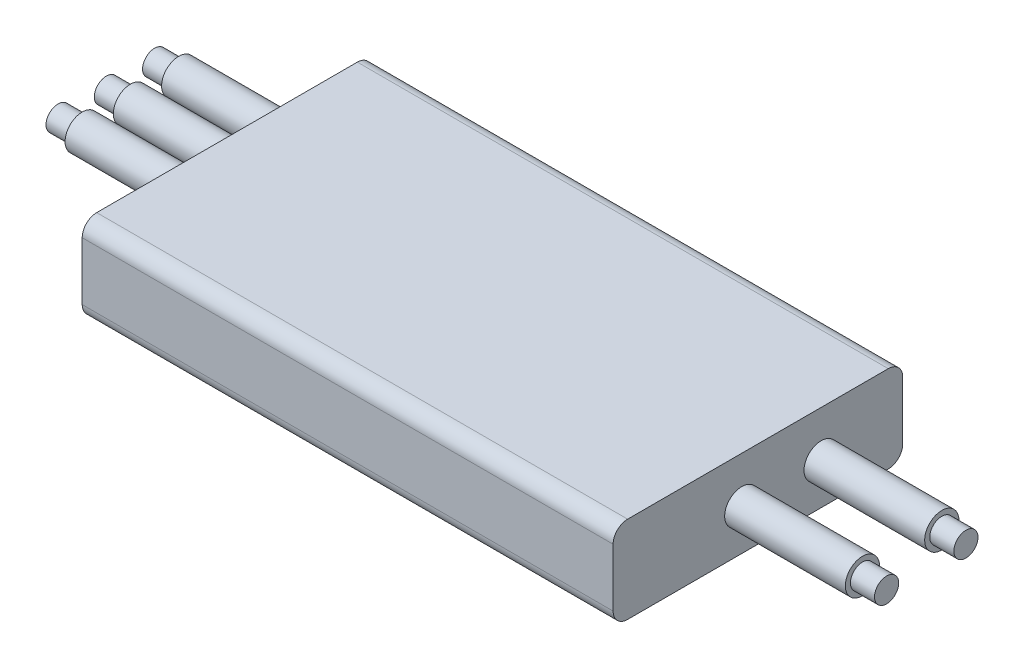
ISO-10303-21;
HEADER;
FILE_DESCRIPTION(('STEP AP214'),'2;1');
FILE_NAME('part.step','',(''),(''),'','','');
FILE_SCHEMA(('AUTOMOTIVE_DESIGN { 1 0 10303 214 1 1 1 1 }'));
ENDSEC;
DATA;
#1=APPLICATION_CONTEXT('core data for automotive mechanical design processes');
#2=APPLICATION_PROTOCOL_DEFINITION('international standard','automotive_design',2000,#1);
#3=PRODUCT_CONTEXT('',#1,'mechanical');
#4=PRODUCT('Part','Part','',(#3));
#5=PRODUCT_RELATED_PRODUCT_CATEGORY('part','',(#4));
#6=PRODUCT_DEFINITION_FORMATION('','',#4);
#7=PRODUCT_DEFINITION_CONTEXT('part definition',#1,'design');
#8=PRODUCT_DEFINITION('design','',#6,#7);
#9=PRODUCT_DEFINITION_SHAPE('','',#8);
#10=(LENGTH_UNIT() NAMED_UNIT(*) SI_UNIT(.MILLI.,.METRE.));
#11=(NAMED_UNIT(*) PLANE_ANGLE_UNIT() SI_UNIT($,.RADIAN.));
#12=(NAMED_UNIT(*) SI_UNIT($,.STERADIAN.) SOLID_ANGLE_UNIT());
#13=UNCERTAINTY_MEASURE_WITH_UNIT(LENGTH_MEASURE(1.E-05),#10,'distance_accuracy_value','');
#14=(GEOMETRIC_REPRESENTATION_CONTEXT(3) GLOBAL_UNCERTAINTY_ASSIGNED_CONTEXT((#13)) GLOBAL_UNIT_ASSIGNED_CONTEXT((#10,
#11,#12)) REPRESENTATION_CONTEXT('',''));
#15=CARTESIAN_POINT('',(0.,0.,0.));
#16=DIRECTION('',(0.,0.,1.));
#17=DIRECTION('',(1.,0.,0.));
#18=AXIS2_PLACEMENT_3D('',#15,#16,#17);
#19=CARTESIAN_POINT('',(55.,18.,30.));
#20=DIRECTION('',(-1.,0.,0.));
#21=DIRECTION('',(0.,0.,1.));
#22=AXIS2_PLACEMENT_3D('',#19,#20,#21);
#23=PLANE('',#22);
#24=CARTESIAN_POINT('',(55.,8.46731324057259,3.3455868551151));
#25=DIRECTION('',(-1.,0.,0.));
#26=DIRECTION('',(0.,0.,1.));
#27=AXIS2_PLACEMENT_3D('',#24,#25,#26);
#28=CIRCLE('',#27,3.55);
#29=CARTESIAN_POINT('',(55.,8.46731324057259,6.8955868551151));
#30=VERTEX_POINT('',#29);
#31=EDGE_CURVE('E158',#30,#30,#28,.F.);
#32=ORIENTED_EDGE('',*,*,#31,.F.);
#33=EDGE_LOOP('',(#32));
#34=FACE_BOUND('',#33,.T.);
#35=CARTESIAN_POINT('',(55.,8.46731324057259,-13.0906615531234));
#36=DIRECTION('',(-1.,0.,0.));
#37=DIRECTION('',(0.,0.,1.));
#38=AXIS2_PLACEMENT_3D('',#35,#36,#37);
#39=CIRCLE('',#38,3.55);
#40=CARTESIAN_POINT('',(55.,8.46731324057259,-9.54066155312344));
#41=VERTEX_POINT('',#40);
#42=EDGE_CURVE('E155',#41,#41,#39,.F.);
#43=ORIENTED_EDGE('',*,*,#42,.F.);
#44=EDGE_LOOP('',(#43));
#45=FACE_BOUND('',#44,.T.);
#46=DIRECTION('',(0.,0.,-1.));
#47=VECTOR('',#46,1.);
#48=CARTESIAN_POINT('',(55.,0.,30.));
#49=LINE('',#48,#47);
#50=CARTESIAN_POINT('',(55.,0.,27.));
#51=VERTEX_POINT('',#50);
#52=CARTESIAN_POINT('',(55.,0.,-27.));
#53=VERTEX_POINT('',#52);
#54=EDGE_CURVE('E229',#51,#53,#49,.T.);
#55=ORIENTED_EDGE('',*,*,#54,.T.);
#56=CARTESIAN_POINT('',(55.,3.,-27.));
#57=DIRECTION('',(-1.,0.,0.));
#58=DIRECTION('',(0.,0.,1.));
#59=AXIS2_PLACEMENT_3D('',#56,#57,#58);
#60=CIRCLE('',#59,3.);
#61=CARTESIAN_POINT('',(55.,3.,-30.));
#62=VERTEX_POINT('',#61);
#63=EDGE_CURVE('E144',#53,#62,#60,.F.);
#64=ORIENTED_EDGE('',*,*,#63,.T.);
#65=DIRECTION('',(0.,-1.,0.));
#66=VECTOR('',#65,1.);
#67=CARTESIAN_POINT('',(55.,18.,-30.));
#68=LINE('',#67,#66);
#69=CARTESIAN_POINT('',(55.,15.,-30.));
#70=VERTEX_POINT('',#69);
#71=EDGE_CURVE('E123',#70,#62,#68,.T.);
#72=ORIENTED_EDGE('',*,*,#71,.F.);
#73=CARTESIAN_POINT('',(55.,15.,-27.));
#74=DIRECTION('',(-1.,0.,0.));
#75=DIRECTION('',(0.,0.,1.));
#76=AXIS2_PLACEMENT_3D('',#73,#74,#75);
#77=CIRCLE('',#76,3.);
#78=CARTESIAN_POINT('',(55.,18.,-27.));
#79=VERTEX_POINT('',#78);
#80=EDGE_CURVE('E128',#70,#79,#77,.F.);
#81=ORIENTED_EDGE('',*,*,#80,.T.);
#82=DIRECTION('',(0.,0.,-1.));
#83=VECTOR('',#82,1.);
#84=CARTESIAN_POINT('',(55.,18.,30.));
#85=LINE('',#84,#83);
#86=CARTESIAN_POINT('',(55.,18.,27.));
#87=VERTEX_POINT('',#86);
#88=EDGE_CURVE('E228',#87,#79,#85,.T.);
#89=ORIENTED_EDGE('',*,*,#88,.F.);
#90=CARTESIAN_POINT('',(55.,15.,27.));
#91=DIRECTION('',(-1.,0.,0.));
#92=DIRECTION('',(0.,0.,1.));
#93=AXIS2_PLACEMENT_3D('',#90,#91,#92);
#94=CIRCLE('',#93,3.);
#95=CARTESIAN_POINT('',(55.,15.,30.));
#96=VERTEX_POINT('',#95);
#97=EDGE_CURVE('E58',#87,#96,#94,.F.);
#98=ORIENTED_EDGE('',*,*,#97,.T.);
#99=DIRECTION('',(0.,-1.,0.));
#100=VECTOR('',#99,1.);
#101=CARTESIAN_POINT('',(55.,18.,30.));
#102=LINE('',#101,#100);
#103=CARTESIAN_POINT('',(55.,3.,30.));
#104=VERTEX_POINT('',#103);
#105=EDGE_CURVE('E223',#96,#104,#102,.T.);
#106=ORIENTED_EDGE('',*,*,#105,.T.);
#107=CARTESIAN_POINT('',(55.,3.,27.));
#108=DIRECTION('',(-1.,0.,0.));
#109=DIRECTION('',(0.,0.,1.));
#110=AXIS2_PLACEMENT_3D('',#107,#108,#109);
#111=CIRCLE('',#110,3.);
#112=EDGE_CURVE('E50',#104,#51,#111,.F.);
#113=ORIENTED_EDGE('',*,*,#112,.T.);
#114=EDGE_LOOP('',(#55,#64,#72,#81,#89,#98,#106,#113));
#115=FACE_BOUND('',#114,.T.);
#116=ADVANCED_FACE('F35',(#34,#45,#115),#23,.F.);
#117=CARTESIAN_POINT('',(-55.,18.,-30.));
#118=DIRECTION('',(0.,0.,1.));
#119=DIRECTION('',(1.,0.,0.));
#120=AXIS2_PLACEMENT_3D('',#117,#118,#119);
#121=PLANE('',#120);
#122=ORIENTED_EDGE('',*,*,#71,.T.);
#123=DIRECTION('',(-1.,0.,0.));
#124=VECTOR('',#123,1.);
#125=CARTESIAN_POINT('',(-55.,3.,-30.));
#126=LINE('',#125,#124);
#127=CARTESIAN_POINT('',(-55.,3.,-30.));
#128=VERTEX_POINT('',#127);
#129=EDGE_CURVE('E122',#62,#128,#126,.T.);
#130=ORIENTED_EDGE('',*,*,#129,.T.);
#131=DIRECTION('',(0.,-1.,0.));
#132=VECTOR('',#131,1.);
#133=CARTESIAN_POINT('',(-55.,18.,-30.));
#134=LINE('',#133,#132);
#135=CARTESIAN_POINT('',(-55.,15.,-30.));
#136=VERTEX_POINT('',#135);
#137=EDGE_CURVE('E105',#136,#128,#134,.T.);
#138=ORIENTED_EDGE('',*,*,#137,.F.);
#139=DIRECTION('',(-1.,0.,0.));
#140=VECTOR('',#139,1.);
#141=CARTESIAN_POINT('',(-55.,15.,-30.));
#142=LINE('',#141,#140);
#143=EDGE_CURVE('E119',#136,#70,#142,.F.);
#144=ORIENTED_EDGE('',*,*,#143,.T.);
#145=EDGE_LOOP('',(#122,#130,#138,#144));
#146=FACE_BOUND('',#145,.T.);
#147=ADVANCED_FACE('F118',(#146),#121,.F.);
#148=CARTESIAN_POINT('',(-55.,18.,30.));
#149=DIRECTION('',(1.,0.,0.));
#150=DIRECTION('',(0.,0.,-1.));
#151=AXIS2_PLACEMENT_3D('',#148,#149,#150);
#152=PLANE('',#151);
#153=CARTESIAN_POINT('',(-55.,9.,-4.99999999999999));
#154=DIRECTION('',(1.,0.,0.));
#155=DIRECTION('',(0.,0.,-1.));
#156=AXIS2_PLACEMENT_3D('',#153,#154,#155);
#157=CIRCLE('',#156,3.55);
#158=CARTESIAN_POINT('',(-55.,9.,-8.54999999999999));
#159=VERTEX_POINT('',#158);
#160=EDGE_CURVE('E11',#159,#159,#157,.F.);
#161=ORIENTED_EDGE('',*,*,#160,.F.);
#162=EDGE_LOOP('',(#161));
#163=FACE_BOUND('',#162,.T.);
#164=CARTESIAN_POINT('',(-55.,9.,5.00000000000001));
#165=DIRECTION('',(1.,0.,0.));
#166=DIRECTION('',(0.,0.,-1.));
#167=AXIS2_PLACEMENT_3D('',#164,#165,#166);
#168=CIRCLE('',#167,3.55);
#169=CARTESIAN_POINT('',(-55.,9.,1.45000000000001));
#170=VERTEX_POINT('',#169);
#171=EDGE_CURVE('E43',#170,#170,#168,.F.);
#172=ORIENTED_EDGE('',*,*,#171,.F.);
#173=EDGE_LOOP('',(#172));
#174=FACE_BOUND('',#173,.T.);
#175=CARTESIAN_POINT('',(-55.,9.,-15.));
#176=DIRECTION('',(1.,0.,0.));
#177=DIRECTION('',(0.,0.,-1.));
#178=AXIS2_PLACEMENT_3D('',#175,#176,#177);
#179=CIRCLE('',#178,3.55);
#180=CARTESIAN_POINT('',(-55.,9.,-18.55));
#181=VERTEX_POINT('',#180);
#182=EDGE_CURVE('E161',#181,#181,#179,.F.);
#183=ORIENTED_EDGE('',*,*,#182,.F.);
#184=EDGE_LOOP('',(#183));
#185=FACE_BOUND('',#184,.T.);
#186=ORIENTED_EDGE('',*,*,#137,.T.);
#187=CARTESIAN_POINT('',(-55.,3.,-27.));
#188=DIRECTION('',(1.,0.,0.));
#189=DIRECTION('',(0.,0.,-1.));
#190=AXIS2_PLACEMENT_3D('',#187,#188,#189);
#191=CIRCLE('',#190,3.);
#192=CARTESIAN_POINT('',(-55.,0.,-27.));
#193=VERTEX_POINT('',#192);
#194=EDGE_CURVE('E112',#128,#193,#191,.F.);
#195=ORIENTED_EDGE('',*,*,#194,.T.);
#196=DIRECTION('',(0.,0.,1.));
#197=VECTOR('',#196,1.);
#198=CARTESIAN_POINT('',(-55.,0.,30.));
#199=LINE('',#198,#197);
#200=CARTESIAN_POINT('',(-55.,0.,27.));
#201=VERTEX_POINT('',#200);
#202=EDGE_CURVE('E220',#193,#201,#199,.T.);
#203=ORIENTED_EDGE('',*,*,#202,.T.);
#204=CARTESIAN_POINT('',(-55.,3.,27.));
#205=DIRECTION('',(1.,0.,0.));
#206=DIRECTION('',(0.,0.,-1.));
#207=AXIS2_PLACEMENT_3D('',#204,#205,#206);
#208=CIRCLE('',#207,3.);
#209=CARTESIAN_POINT('',(-55.,3.,30.));
#210=VERTEX_POINT('',#209);
#211=EDGE_CURVE('E113',#201,#210,#208,.F.);
#212=ORIENTED_EDGE('',*,*,#211,.T.);
#213=DIRECTION('',(0.,-1.,0.));
#214=VECTOR('',#213,1.);
#215=CARTESIAN_POINT('',(-55.,18.,30.));
#216=LINE('',#215,#214);
#217=CARTESIAN_POINT('',(-55.,15.,30.));
#218=VERTEX_POINT('',#217);
#219=EDGE_CURVE('E124',#218,#210,#216,.T.);
#220=ORIENTED_EDGE('',*,*,#219,.F.);
#221=CARTESIAN_POINT('',(-55.,15.,27.));
#222=DIRECTION('',(1.,0.,0.));
#223=DIRECTION('',(0.,0.,-1.));
#224=AXIS2_PLACEMENT_3D('',#221,#222,#223);
#225=CIRCLE('',#224,3.);
#226=CARTESIAN_POINT('',(-55.,18.,27.));
#227=VERTEX_POINT('',#226);
#228=EDGE_CURVE('E130',#218,#227,#225,.F.);
#229=ORIENTED_EDGE('',*,*,#228,.T.);
#230=DIRECTION('',(0.,0.,1.));
#231=VECTOR('',#230,1.);
#232=CARTESIAN_POINT('',(-55.,18.,30.));
#233=LINE('',#232,#231);
#234=CARTESIAN_POINT('',(-55.,18.,-27.));
#235=VERTEX_POINT('',#234);
#236=EDGE_CURVE('E107',#235,#227,#233,.T.);
#237=ORIENTED_EDGE('',*,*,#236,.F.);
#238=CARTESIAN_POINT('',(-55.,15.,-27.));
#239=DIRECTION('',(1.,0.,0.));
#240=DIRECTION('',(0.,0.,-1.));
#241=AXIS2_PLACEMENT_3D('',#238,#239,#240);
#242=CIRCLE('',#241,3.);
#243=EDGE_CURVE('E102',#235,#136,#242,.F.);
#244=ORIENTED_EDGE('',*,*,#243,.T.);
#245=EDGE_LOOP('',(#186,#195,#203,#212,#220,#229,#237,#244));
#246=FACE_BOUND('',#245,.T.);
#247=ADVANCED_FACE('F104',(#163,#174,#185,#246),#152,.F.);
#248=CARTESIAN_POINT('',(-55.,18.,30.));
#249=DIRECTION('',(0.,0.,-1.));
#250=DIRECTION('',(-1.,0.,0.));
#251=AXIS2_PLACEMENT_3D('',#248,#249,#250);
#252=PLANE('',#251);
#253=ORIENTED_EDGE('',*,*,#219,.T.);
#254=DIRECTION('',(1.,0.,0.));
#255=VECTOR('',#254,1.);
#256=CARTESIAN_POINT('',(55.,3.,30.));
#257=LINE('',#256,#255);
#258=EDGE_CURVE('E153',#210,#104,#257,.T.);
#259=ORIENTED_EDGE('',*,*,#258,.T.);
#260=ORIENTED_EDGE('',*,*,#105,.F.);
#261=DIRECTION('',(1.,0.,0.));
#262=VECTOR('',#261,1.);
#263=CARTESIAN_POINT('',(-55.,15.,30.));
#264=LINE('',#263,#262);
#265=EDGE_CURVE('E151',#96,#218,#264,.F.);
#266=ORIENTED_EDGE('',*,*,#265,.T.);
#267=EDGE_LOOP('',(#253,#259,#260,#266));
#268=FACE_BOUND('',#267,.T.);
#269=ADVANCED_FACE('F170',(#268),#252,.F.);
#270=CARTESIAN_POINT('',(0.,18.,0.));
#271=DIRECTION('',(0.,-1.,0.));
#272=DIRECTION('',(0.,0.,-1.));
#273=AXIS2_PLACEMENT_3D('',#270,#271,#272);
#274=PLANE('',#273);
#275=ORIENTED_EDGE('',*,*,#88,.T.);
#276=DIRECTION('',(-1.,0.,0.));
#277=VECTOR('',#276,1.);
#278=CARTESIAN_POINT('',(0.,18.,-27.));
#279=LINE('',#278,#277);
#280=EDGE_CURVE('E149',#79,#235,#279,.T.);
#281=ORIENTED_EDGE('',*,*,#280,.T.);
#282=ORIENTED_EDGE('',*,*,#236,.T.);
#283=DIRECTION('',(1.,0.,0.));
#284=VECTOR('',#283,1.);
#285=CARTESIAN_POINT('',(0.,18.,27.));
#286=LINE('',#285,#284);
#287=EDGE_CURVE('E146',#227,#87,#286,.T.);
#288=ORIENTED_EDGE('',*,*,#287,.T.);
#289=EDGE_LOOP('',(#275,#281,#282,#288));
#290=FACE_BOUND('',#289,.T.);
#291=ADVANCED_FACE('F305',(#290),#274,.F.);
#292=CARTESIAN_POINT('',(0.,0.,0.));
#293=DIRECTION('',(0.,-1.,0.));
#294=DIRECTION('',(0.,0.,-1.));
#295=AXIS2_PLACEMENT_3D('',#292,#293,#294);
#296=PLANE('',#295);
#297=ORIENTED_EDGE('',*,*,#202,.F.);
#298=DIRECTION('',(-1.,0.,0.));
#299=VECTOR('',#298,1.);
#300=CARTESIAN_POINT('',(55.,0.,-27.));
#301=LINE('',#300,#299);
#302=EDGE_CURVE('E139',#193,#53,#301,.F.);
#303=ORIENTED_EDGE('',*,*,#302,.T.);
#304=ORIENTED_EDGE('',*,*,#54,.F.);
#305=DIRECTION('',(1.,0.,0.));
#306=VECTOR('',#305,1.);
#307=CARTESIAN_POINT('',(-55.,0.,27.));
#308=LINE('',#307,#306);
#309=EDGE_CURVE('E137',#51,#201,#308,.F.);
#310=ORIENTED_EDGE('',*,*,#309,.T.);
#311=EDGE_LOOP('',(#297,#303,#304,#310));
#312=FACE_BOUND('',#311,.T.);
#313=ADVANCED_FACE('F204',(#312),#296,.T.);
#314=CARTESIAN_POINT('',(-55.,3.,-27.));
#315=DIRECTION('',(1.,0.,0.));
#316=DIRECTION('',(0.,0.,-1.));
#317=AXIS2_PLACEMENT_3D('',#314,#315,#316);
#318=CYLINDRICAL_SURFACE('',#317,3.);
#319=ORIENTED_EDGE('',*,*,#63,.F.);
#320=ORIENTED_EDGE('',*,*,#302,.F.);
#321=ORIENTED_EDGE('',*,*,#194,.F.);
#322=ORIENTED_EDGE('',*,*,#129,.F.);
#323=EDGE_LOOP('',(#319,#320,#321,#322));
#324=FACE_BOUND('',#323,.T.);
#325=ADVANCED_FACE('F201',(#324),#318,.T.);
#326=CARTESIAN_POINT('',(0.,15.,-27.));
#327=DIRECTION('',(-1.,0.,0.));
#328=DIRECTION('',(0.,0.,1.));
#329=AXIS2_PLACEMENT_3D('',#326,#327,#328);
#330=CYLINDRICAL_SURFACE('',#329,3.);
#331=ORIENTED_EDGE('',*,*,#80,.F.);
#332=ORIENTED_EDGE('',*,*,#143,.F.);
#333=ORIENTED_EDGE('',*,*,#243,.F.);
#334=ORIENTED_EDGE('',*,*,#280,.F.);
#335=EDGE_LOOP('',(#331,#332,#333,#334));
#336=FACE_BOUND('',#335,.T.);
#337=ADVANCED_FACE('F127',(#336),#330,.T.);
#338=CARTESIAN_POINT('',(-55.,3.,27.));
#339=DIRECTION('',(-1.,0.,0.));
#340=DIRECTION('',(0.,0.,1.));
#341=AXIS2_PLACEMENT_3D('',#338,#339,#340);
#342=CYLINDRICAL_SURFACE('',#341,3.);
#343=ORIENTED_EDGE('',*,*,#211,.F.);
#344=ORIENTED_EDGE('',*,*,#309,.F.);
#345=ORIENTED_EDGE('',*,*,#112,.F.);
#346=ORIENTED_EDGE('',*,*,#258,.F.);
#347=EDGE_LOOP('',(#343,#344,#345,#346));
#348=FACE_BOUND('',#347,.T.);
#349=ADVANCED_FACE('F207',(#348),#342,.T.);
#350=CARTESIAN_POINT('',(0.,15.,27.));
#351=DIRECTION('',(1.,0.,0.));
#352=DIRECTION('',(0.,0.,-1.));
#353=AXIS2_PLACEMENT_3D('',#350,#351,#352);
#354=CYLINDRICAL_SURFACE('',#353,3.);
#355=ORIENTED_EDGE('',*,*,#228,.F.);
#356=ORIENTED_EDGE('',*,*,#265,.F.);
#357=ORIENTED_EDGE('',*,*,#97,.F.);
#358=ORIENTED_EDGE('',*,*,#287,.F.);
#359=EDGE_LOOP('',(#355,#356,#357,#358));
#360=FACE_BOUND('',#359,.T.);
#361=ADVANCED_FACE('F37',(#360),#354,.T.);
#362=CARTESIAN_POINT('',(80.,8.46731324057259,-13.0906615531234));
#363=DIRECTION('',(-1.,0.,0.));
#364=DIRECTION('',(0.,0.,1.));
#365=AXIS2_PLACEMENT_3D('',#362,#363,#364);
#366=CYLINDRICAL_SURFACE('',#365,3.55);
#367=CARTESIAN_POINT('',(80.,8.46731324057259,-13.0906615531234));
#368=DIRECTION('',(1.,0.,0.));
#369=DIRECTION('',(0.,0.,-1.));
#370=AXIS2_PLACEMENT_3D('',#367,#368,#369);
#371=CIRCLE('',#370,3.55);
#372=CARTESIAN_POINT('',(80.,8.46731324057259,-16.6406615531234));
#373=VERTEX_POINT('',#372);
#374=EDGE_CURVE('E232',#373,#373,#371,.T.);
#375=ORIENTED_EDGE('',*,*,#374,.F.);
#376=EDGE_LOOP('',(#375));
#377=FACE_BOUND('',#376,.T.);
#378=ORIENTED_EDGE('',*,*,#42,.T.);
#379=EDGE_LOOP('',(#378));
#380=FACE_BOUND('',#379,.T.);
#381=ADVANCED_FACE('F212',(#377,#380),#366,.T.);
#382=CARTESIAN_POINT('',(80.,8.46731324057259,-13.0906615531234));
#383=DIRECTION('',(1.,0.,0.));
#384=DIRECTION('',(0.,0.,-1.));
#385=AXIS2_PLACEMENT_3D('',#382,#383,#384);
#386=PLANE('',#385);
#387=CARTESIAN_POINT('',(80.,8.46731324057259,-13.0906615531234));
#388=DIRECTION('',(1.,0.,0.));
#389=DIRECTION('',(0.,0.,-1.));
#390=AXIS2_PLACEMENT_3D('',#387,#388,#389);
#391=CIRCLE('',#390,2.5);
#392=CARTESIAN_POINT('',(80.,8.46731324057259,-15.5906615531234));
#393=VERTEX_POINT('',#392);
#394=EDGE_CURVE('E275',#393,#393,#391,.T.);
#395=ORIENTED_EDGE('',*,*,#394,.F.);
#396=EDGE_LOOP('',(#395));
#397=FACE_BOUND('',#396,.T.);
#398=ORIENTED_EDGE('',*,*,#374,.T.);
#399=EDGE_LOOP('',(#398));
#400=FACE_BOUND('',#399,.T.);
#401=ADVANCED_FACE('F290',(#397,#400),#386,.T.);
#402=CARTESIAN_POINT('',(80.,8.46731324057259,3.3455868551151));
#403=DIRECTION('',(-1.,0.,0.));
#404=DIRECTION('',(0.,0.,1.));
#405=AXIS2_PLACEMENT_3D('',#402,#403,#404);
#406=CYLINDRICAL_SURFACE('',#405,3.55);
#407=CARTESIAN_POINT('',(80.,8.46731324057259,3.3455868551151));
#408=DIRECTION('',(1.,0.,0.));
#409=DIRECTION('',(0.,0.,-1.));
#410=AXIS2_PLACEMENT_3D('',#407,#408,#409);
#411=CIRCLE('',#410,3.55);
#412=CARTESIAN_POINT('',(80.,8.46731324057259,-0.204413144884899));
#413=VERTEX_POINT('',#412);
#414=EDGE_CURVE('E238',#413,#413,#411,.T.);
#415=ORIENTED_EDGE('',*,*,#414,.F.);
#416=EDGE_LOOP('',(#415));
#417=FACE_BOUND('',#416,.T.);
#418=ORIENTED_EDGE('',*,*,#31,.T.);
#419=EDGE_LOOP('',(#418));
#420=FACE_BOUND('',#419,.T.);
#421=ADVANCED_FACE('F187',(#417,#420),#406,.T.);
#422=CARTESIAN_POINT('',(80.,8.46731324057259,3.3455868551151));
#423=DIRECTION('',(1.,0.,0.));
#424=DIRECTION('',(0.,0.,-1.));
#425=AXIS2_PLACEMENT_3D('',#422,#423,#424);
#426=PLANE('',#425);
#427=CARTESIAN_POINT('',(80.,8.46731324057259,3.3455868551151));
#428=DIRECTION('',(1.,0.,0.));
#429=DIRECTION('',(0.,0.,-1.));
#430=AXIS2_PLACEMENT_3D('',#427,#428,#429);
#431=CIRCLE('',#430,2.5);
#432=CARTESIAN_POINT('',(80.,8.46731324057259,0.8455868551151));
#433=VERTEX_POINT('',#432);
#434=EDGE_CURVE('E269',#433,#433,#431,.T.);
#435=ORIENTED_EDGE('',*,*,#434,.F.);
#436=EDGE_LOOP('',(#435));
#437=FACE_BOUND('',#436,.T.);
#438=ORIENTED_EDGE('',*,*,#414,.T.);
#439=EDGE_LOOP('',(#438));
#440=FACE_BOUND('',#439,.T.);
#441=ADVANCED_FACE('F178',(#437,#440),#426,.T.);
#442=CARTESIAN_POINT('',(-80.,9.,-15.));
#443=DIRECTION('',(1.,0.,0.));
#444=DIRECTION('',(0.,0.,-1.));
#445=AXIS2_PLACEMENT_3D('',#442,#443,#444);
#446=CYLINDRICAL_SURFACE('',#445,3.55);
#447=CARTESIAN_POINT('',(-80.,9.,-15.));
#448=DIRECTION('',(-1.,0.,0.));
#449=DIRECTION('',(0.,0.,1.));
#450=AXIS2_PLACEMENT_3D('',#447,#448,#449);
#451=CIRCLE('',#450,3.55);
#452=CARTESIAN_POINT('',(-80.,9.,-11.45));
#453=VERTEX_POINT('',#452);
#454=EDGE_CURVE('E241',#453,#453,#451,.T.);
#455=ORIENTED_EDGE('',*,*,#454,.F.);
#456=EDGE_LOOP('',(#455));
#457=FACE_BOUND('',#456,.T.);
#458=ORIENTED_EDGE('',*,*,#182,.T.);
#459=EDGE_LOOP('',(#458));
#460=FACE_BOUND('',#459,.T.);
#461=ADVANCED_FACE('F175',(#457,#460),#446,.T.);
#462=CARTESIAN_POINT('',(-80.,9.,-15.));
#463=DIRECTION('',(-1.,0.,0.));
#464=DIRECTION('',(0.,0.,1.));
#465=AXIS2_PLACEMENT_3D('',#462,#463,#464);
#466=PLANE('',#465);
#467=CARTESIAN_POINT('',(-80.,9.,-15.));
#468=DIRECTION('',(-1.,0.,0.));
#469=DIRECTION('',(0.,0.,1.));
#470=AXIS2_PLACEMENT_3D('',#467,#468,#469);
#471=CIRCLE('',#470,2.5);
#472=CARTESIAN_POINT('',(-80.,9.,-12.5));
#473=VERTEX_POINT('',#472);
#474=EDGE_CURVE('E251',#473,#473,#471,.T.);
#475=ORIENTED_EDGE('',*,*,#474,.F.);
#476=EDGE_LOOP('',(#475));
#477=FACE_BOUND('',#476,.T.);
#478=ORIENTED_EDGE('',*,*,#454,.T.);
#479=EDGE_LOOP('',(#478));
#480=FACE_BOUND('',#479,.T.);
#481=ADVANCED_FACE('F177',(#477,#480),#466,.T.);
#482=CARTESIAN_POINT('',(-80.,9.,5.00000000000001));
#483=DIRECTION('',(1.,0.,0.));
#484=DIRECTION('',(0.,0.,-1.));
#485=AXIS2_PLACEMENT_3D('',#482,#483,#484);
#486=CYLINDRICAL_SURFACE('',#485,3.55);
#487=CARTESIAN_POINT('',(-80.,9.,5.00000000000001));
#488=DIRECTION('',(-1.,0.,0.));
#489=DIRECTION('',(0.,0.,1.));
#490=AXIS2_PLACEMENT_3D('',#487,#488,#489);
#491=CIRCLE('',#490,3.55);
#492=CARTESIAN_POINT('',(-80.,9.,8.55000000000001));
#493=VERTEX_POINT('',#492);
#494=EDGE_CURVE('E244',#493,#493,#491,.T.);
#495=ORIENTED_EDGE('',*,*,#494,.F.);
#496=EDGE_LOOP('',(#495));
#497=FACE_BOUND('',#496,.T.);
#498=ORIENTED_EDGE('',*,*,#171,.T.);
#499=EDGE_LOOP('',(#498));
#500=FACE_BOUND('',#499,.T.);
#501=ADVANCED_FACE('F166',(#497,#500),#486,.T.);
#502=CARTESIAN_POINT('',(-80.,9.,5.00000000000001));
#503=DIRECTION('',(-1.,0.,0.));
#504=DIRECTION('',(0.,0.,1.));
#505=AXIS2_PLACEMENT_3D('',#502,#503,#504);
#506=PLANE('',#505);
#507=CARTESIAN_POINT('',(-80.,9.,5.00000000000001));
#508=DIRECTION('',(-1.,0.,0.));
#509=DIRECTION('',(0.,0.,1.));
#510=AXIS2_PLACEMENT_3D('',#507,#508,#509);
#511=CIRCLE('',#510,2.5);
#512=CARTESIAN_POINT('',(-80.,9.,7.50000000000001));
#513=VERTEX_POINT('',#512);
#514=EDGE_CURVE('E263',#513,#513,#511,.T.);
#515=ORIENTED_EDGE('',*,*,#514,.F.);
#516=EDGE_LOOP('',(#515));
#517=FACE_BOUND('',#516,.T.);
#518=ORIENTED_EDGE('',*,*,#494,.T.);
#519=EDGE_LOOP('',(#518));
#520=FACE_BOUND('',#519,.T.);
#521=ADVANCED_FACE('F396',(#517,#520),#506,.T.);
#522=CARTESIAN_POINT('',(-80.,9.,-4.99999999999999));
#523=DIRECTION('',(1.,0.,0.));
#524=DIRECTION('',(0.,0.,-1.));
#525=AXIS2_PLACEMENT_3D('',#522,#523,#524);
#526=CYLINDRICAL_SURFACE('',#525,3.55);
#527=CARTESIAN_POINT('',(-80.,9.,-4.99999999999999));
#528=DIRECTION('',(-1.,0.,0.));
#529=DIRECTION('',(0.,0.,1.));
#530=AXIS2_PLACEMENT_3D('',#527,#528,#529);
#531=CIRCLE('',#530,3.55);
#532=CARTESIAN_POINT('',(-80.,9.,-1.44999999999999));
#533=VERTEX_POINT('',#532);
#534=EDGE_CURVE('E247',#533,#533,#531,.T.);
#535=ORIENTED_EDGE('',*,*,#534,.F.);
#536=EDGE_LOOP('',(#535));
#537=FACE_BOUND('',#536,.T.);
#538=ORIENTED_EDGE('',*,*,#160,.T.);
#539=EDGE_LOOP('',(#538));
#540=FACE_BOUND('',#539,.T.);
#541=ADVANCED_FACE('F387',(#537,#540),#526,.T.);
#542=CARTESIAN_POINT('',(-80.,9.,-4.99999999999999));
#543=DIRECTION('',(-1.,0.,0.));
#544=DIRECTION('',(0.,0.,1.));
#545=AXIS2_PLACEMENT_3D('',#542,#543,#544);
#546=PLANE('',#545);
#547=CARTESIAN_POINT('',(-80.,9.,-4.99999999999999));
#548=DIRECTION('',(-1.,0.,0.));
#549=DIRECTION('',(0.,0.,1.));
#550=AXIS2_PLACEMENT_3D('',#547,#548,#549);
#551=CIRCLE('',#550,2.5);
#552=CARTESIAN_POINT('',(-80.,9.,-2.49999999999999));
#553=VERTEX_POINT('',#552);
#554=EDGE_CURVE('E257',#553,#553,#551,.T.);
#555=ORIENTED_EDGE('',*,*,#554,.F.);
#556=EDGE_LOOP('',(#555));
#557=FACE_BOUND('',#556,.T.);
#558=ORIENTED_EDGE('',*,*,#534,.T.);
#559=EDGE_LOOP('',(#558));
#560=FACE_BOUND('',#559,.T.);
#561=ADVANCED_FACE('F380',(#557,#560),#546,.T.);
#562=CARTESIAN_POINT('',(-85.,9.,-15.));
#563=DIRECTION('',(1.,0.,0.));
#564=DIRECTION('',(0.,0.,-1.));
#565=AXIS2_PLACEMENT_3D('',#562,#563,#564);
#566=CYLINDRICAL_SURFACE('',#565,2.5);
#567=CARTESIAN_POINT('',(-85.,9.,-15.));
#568=DIRECTION('',(-1.,0.,0.));
#569=DIRECTION('',(0.,0.,1.));
#570=AXIS2_PLACEMENT_3D('',#567,#568,#569);
#571=CIRCLE('',#570,2.5);
#572=CARTESIAN_POINT('',(-85.,9.,-12.5));
#573=VERTEX_POINT('',#572);
#574=EDGE_CURVE('E250',#573,#573,#571,.T.);
#575=ORIENTED_EDGE('',*,*,#574,.F.);
#576=EDGE_LOOP('',(#575));
#577=FACE_BOUND('',#576,.T.);
#578=ORIENTED_EDGE('',*,*,#474,.T.);
#579=EDGE_LOOP('',(#578));
#580=FACE_BOUND('',#579,.T.);
#581=ADVANCED_FACE('F386',(#577,#580),#566,.T.);
#582=CARTESIAN_POINT('',(-85.,9.,-15.));
#583=DIRECTION('',(-1.,0.,0.));
#584=DIRECTION('',(0.,0.,1.));
#585=AXIS2_PLACEMENT_3D('',#582,#583,#584);
#586=PLANE('',#585);
#587=ORIENTED_EDGE('',*,*,#574,.T.);
#588=EDGE_LOOP('',(#587));
#589=FACE_BOUND('',#588,.T.);
#590=ADVANCED_FACE('F426',(#589),#586,.T.);
#591=CARTESIAN_POINT('',(-85.,9.,-4.99999999999999));
#592=DIRECTION('',(1.,0.,0.));
#593=DIRECTION('',(0.,0.,-1.));
#594=AXIS2_PLACEMENT_3D('',#591,#592,#593);
#595=CYLINDRICAL_SURFACE('',#594,2.5);
#596=CARTESIAN_POINT('',(-85.,9.,-4.99999999999999));
#597=DIRECTION('',(-1.,0.,0.));
#598=DIRECTION('',(0.,0.,1.));
#599=AXIS2_PLACEMENT_3D('',#596,#597,#598);
#600=CIRCLE('',#599,2.5);
#601=CARTESIAN_POINT('',(-85.,9.,-2.49999999999999));
#602=VERTEX_POINT('',#601);
#603=EDGE_CURVE('E254',#602,#602,#600,.T.);
#604=ORIENTED_EDGE('',*,*,#603,.F.);
#605=EDGE_LOOP('',(#604));
#606=FACE_BOUND('',#605,.T.);
#607=ORIENTED_EDGE('',*,*,#554,.T.);
#608=EDGE_LOOP('',(#607));
#609=FACE_BOUND('',#608,.T.);
#610=ADVANCED_FACE('F433',(#606,#609),#595,.T.);
#611=CARTESIAN_POINT('',(-85.,9.,-4.99999999999999));
#612=DIRECTION('',(-1.,0.,0.));
#613=DIRECTION('',(0.,0.,1.));
#614=AXIS2_PLACEMENT_3D('',#611,#612,#613);
#615=PLANE('',#614);
#616=ORIENTED_EDGE('',*,*,#603,.T.);
#617=EDGE_LOOP('',(#616));
#618=FACE_BOUND('',#617,.T.);
#619=ADVANCED_FACE('F438',(#618),#615,.T.);
#620=CARTESIAN_POINT('',(-85.,9.,5.00000000000001));
#621=DIRECTION('',(1.,0.,0.));
#622=DIRECTION('',(0.,0.,-1.));
#623=AXIS2_PLACEMENT_3D('',#620,#621,#622);
#624=CYLINDRICAL_SURFACE('',#623,2.5);
#625=CARTESIAN_POINT('',(-85.,9.,5.00000000000001));
#626=DIRECTION('',(-1.,0.,0.));
#627=DIRECTION('',(0.,0.,1.));
#628=AXIS2_PLACEMENT_3D('',#625,#626,#627);
#629=CIRCLE('',#628,2.5);
#630=CARTESIAN_POINT('',(-85.,9.,7.50000000000001));
#631=VERTEX_POINT('',#630);
#632=EDGE_CURVE('E260',#631,#631,#629,.T.);
#633=ORIENTED_EDGE('',*,*,#632,.F.);
#634=EDGE_LOOP('',(#633));
#635=FACE_BOUND('',#634,.T.);
#636=ORIENTED_EDGE('',*,*,#514,.T.);
#637=EDGE_LOOP('',(#636));
#638=FACE_BOUND('',#637,.T.);
#639=ADVANCED_FACE('F446',(#635,#638),#624,.T.);
#640=CARTESIAN_POINT('',(-85.,9.,5.00000000000001));
#641=DIRECTION('',(-1.,0.,0.));
#642=DIRECTION('',(0.,0.,1.));
#643=AXIS2_PLACEMENT_3D('',#640,#641,#642);
#644=PLANE('',#643);
#645=ORIENTED_EDGE('',*,*,#632,.T.);
#646=EDGE_LOOP('',(#645));
#647=FACE_BOUND('',#646,.T.);
#648=ADVANCED_FACE('F451',(#647),#644,.T.);
#649=CARTESIAN_POINT('',(85.,8.46731324057259,3.3455868551151));
#650=DIRECTION('',(-1.,0.,0.));
#651=DIRECTION('',(0.,0.,1.));
#652=AXIS2_PLACEMENT_3D('',#649,#650,#651);
#653=CYLINDRICAL_SURFACE('',#652,2.5);
#654=CARTESIAN_POINT('',(85.,8.46731324057259,3.3455868551151));
#655=DIRECTION('',(1.,0.,0.));
#656=DIRECTION('',(0.,0.,-1.));
#657=AXIS2_PLACEMENT_3D('',#654,#655,#656);
#658=CIRCLE('',#657,2.5);
#659=CARTESIAN_POINT('',(85.,8.46731324057259,0.8455868551151));
#660=VERTEX_POINT('',#659);
#661=EDGE_CURVE('E266',#660,#660,#658,.T.);
#662=ORIENTED_EDGE('',*,*,#661,.F.);
#663=EDGE_LOOP('',(#662));
#664=FACE_BOUND('',#663,.T.);
#665=ORIENTED_EDGE('',*,*,#434,.T.);
#666=EDGE_LOOP('',(#665));
#667=FACE_BOUND('',#666,.T.);
#668=ADVANCED_FACE('F475',(#664,#667),#653,.T.);
#669=CARTESIAN_POINT('',(85.,8.46731324057259,3.3455868551151));
#670=DIRECTION('',(1.,0.,0.));
#671=DIRECTION('',(0.,0.,-1.));
#672=AXIS2_PLACEMENT_3D('',#669,#670,#671);
#673=PLANE('',#672);
#674=ORIENTED_EDGE('',*,*,#661,.T.);
#675=EDGE_LOOP('',(#674));
#676=FACE_BOUND('',#675,.T.);
#677=ADVANCED_FACE('F286',(#676),#673,.T.);
#678=CARTESIAN_POINT('',(85.,8.46731324057259,-13.0906615531234));
#679=DIRECTION('',(-1.,0.,0.));
#680=DIRECTION('',(0.,0.,1.));
#681=AXIS2_PLACEMENT_3D('',#678,#679,#680);
#682=CYLINDRICAL_SURFACE('',#681,2.5);
#683=CARTESIAN_POINT('',(85.,8.46731324057259,-13.0906615531234));
#684=DIRECTION('',(1.,0.,0.));
#685=DIRECTION('',(0.,0.,-1.));
#686=AXIS2_PLACEMENT_3D('',#683,#684,#685);
#687=CIRCLE('',#686,2.5);
#688=CARTESIAN_POINT('',(85.,8.46731324057259,-15.5906615531234));
#689=VERTEX_POINT('',#688);
#690=EDGE_CURVE('E272',#689,#689,#687,.T.);
#691=ORIENTED_EDGE('',*,*,#690,.F.);
#692=EDGE_LOOP('',(#691));
#693=FACE_BOUND('',#692,.T.);
#694=ORIENTED_EDGE('',*,*,#394,.T.);
#695=EDGE_LOOP('',(#694));
#696=FACE_BOUND('',#695,.T.);
#697=ADVANCED_FACE('F283',(#693,#696),#682,.T.);
#698=CARTESIAN_POINT('',(85.,8.46731324057259,-13.0906615531234));
#699=DIRECTION('',(1.,0.,0.));
#700=DIRECTION('',(0.,0.,-1.));
#701=AXIS2_PLACEMENT_3D('',#698,#699,#700);
#702=PLANE('',#701);
#703=ORIENTED_EDGE('',*,*,#690,.T.);
#704=EDGE_LOOP('',(#703));
#705=FACE_BOUND('',#704,.T.);
#706=ADVANCED_FACE('F281',(#705),#702,.T.);
#707=CLOSED_SHELL('',(#116,#147,#247,#269,#291,#313,#325,#337,#349,#361,#381,#401,#421,#441,
#461,#481,#501,#521,#541,#561,#581,#590,#610,#619,#639,#648,#668,#677,#697,#706));
#708=MANIFOLD_SOLID_BREP('B2',#707);
#709=ADVANCED_BREP_SHAPE_REPRESENTATION('',(#18,#708),#14);
#710=SHAPE_DEFINITION_REPRESENTATION(#9,#709);
ENDSEC;
END-ISO-10303-21;
